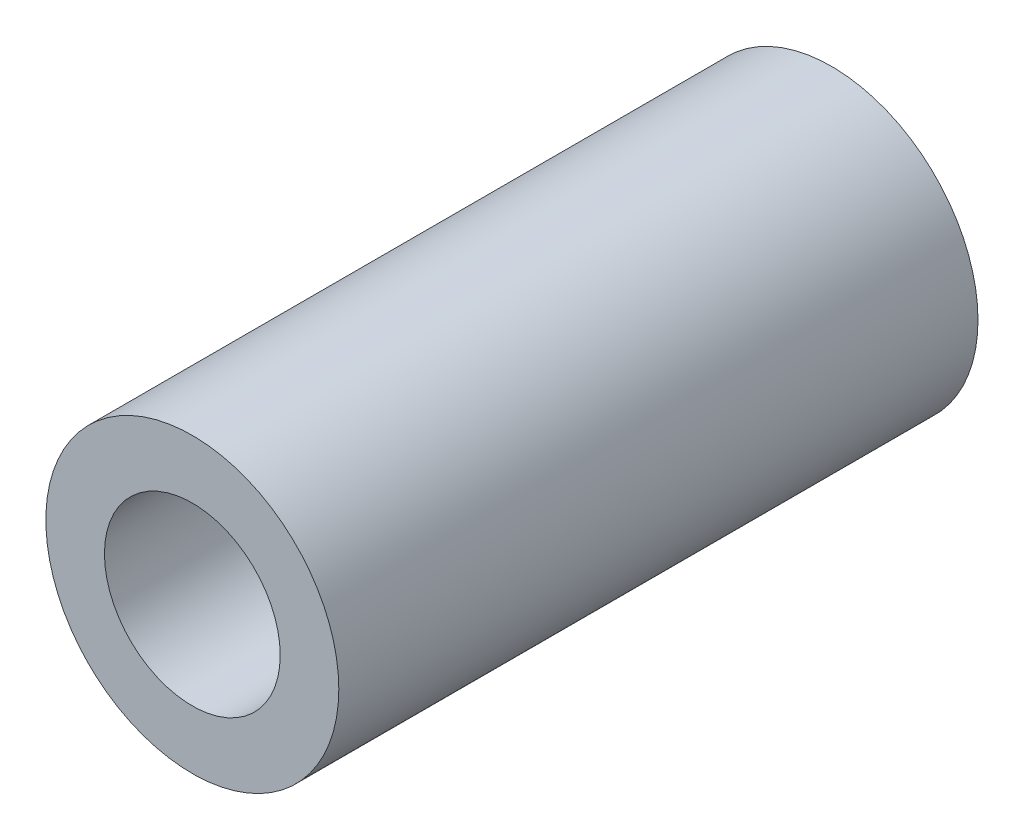
ISO-10303-21;
HEADER;
FILE_DESCRIPTION(('STEP AP214'),'2;1');
FILE_NAME('part.step','',(''),(''),'','','');
FILE_SCHEMA(('AUTOMOTIVE_DESIGN { 1 0 10303 214 1 1 1 1 }'));
ENDSEC;
DATA;
#1=APPLICATION_CONTEXT('core data for automotive mechanical design processes');
#2=APPLICATION_PROTOCOL_DEFINITION('international standard','automotive_design',2000,#1);
#3=PRODUCT_CONTEXT('',#1,'mechanical');
#4=PRODUCT('Part','Part','',(#3));
#5=PRODUCT_RELATED_PRODUCT_CATEGORY('part','',(#4));
#6=PRODUCT_DEFINITION_FORMATION('','',#4);
#7=PRODUCT_DEFINITION_CONTEXT('part definition',#1,'design');
#8=PRODUCT_DEFINITION('design','',#6,#7);
#9=PRODUCT_DEFINITION_SHAPE('','',#8);
#10=(LENGTH_UNIT() NAMED_UNIT(*) SI_UNIT(.MILLI.,.METRE.));
#11=(NAMED_UNIT(*) PLANE_ANGLE_UNIT() SI_UNIT($,.RADIAN.));
#12=(NAMED_UNIT(*) SI_UNIT($,.STERADIAN.) SOLID_ANGLE_UNIT());
#13=UNCERTAINTY_MEASURE_WITH_UNIT(LENGTH_MEASURE(1.E-05),#10,'distance_accuracy_value','');
#14=(GEOMETRIC_REPRESENTATION_CONTEXT(3) GLOBAL_UNCERTAINTY_ASSIGNED_CONTEXT((#13)) GLOBAL_UNIT_ASSIGNED_CONTEXT((#10,
#11,#12)) REPRESENTATION_CONTEXT('',''));
#15=CARTESIAN_POINT('',(0.,0.,0.));
#16=DIRECTION('',(0.,0.,1.));
#17=DIRECTION('',(1.,0.,0.));
#18=AXIS2_PLACEMENT_3D('',#15,#16,#17);
#19=CARTESIAN_POINT('',(0.,0.,12.));
#20=DIRECTION('',(0.,0.,-1.));
#21=DIRECTION('',(-1.,0.,0.));
#22=AXIS2_PLACEMENT_3D('',#19,#20,#21);
#23=CYLINDRICAL_SURFACE('',#22,2.75);
#24=CARTESIAN_POINT('',(0.,0.,12.));
#25=DIRECTION('',(0.,0.,1.));
#26=DIRECTION('',(1.,0.,0.));
#27=AXIS2_PLACEMENT_3D('',#24,#25,#26);
#28=CIRCLE('',#27,2.75);
#29=CARTESIAN_POINT('',(2.75,0.,12.));
#30=VERTEX_POINT('',#29);
#31=EDGE_CURVE('E10',#30,#30,#28,.T.);
#32=ORIENTED_EDGE('',*,*,#31,.F.);
#33=EDGE_LOOP('',(#32));
#34=FACE_BOUND('',#33,.T.);
#35=CARTESIAN_POINT('',(0.,0.,0.));
#36=DIRECTION('',(0.,0.,1.));
#37=DIRECTION('',(1.,0.,0.));
#38=AXIS2_PLACEMENT_3D('',#35,#36,#37);
#39=CIRCLE('',#38,2.75);
#40=CARTESIAN_POINT('',(2.75,0.,0.));
#41=VERTEX_POINT('',#40);
#42=EDGE_CURVE('E39',#41,#41,#39,.T.);
#43=ORIENTED_EDGE('',*,*,#42,.T.);
#44=EDGE_LOOP('',(#43));
#45=FACE_BOUND('',#44,.T.);
#46=ADVANCED_FACE('F36',(#34,#45),#23,.T.);
#47=CARTESIAN_POINT('',(0.,0.,12.));
#48=DIRECTION('',(0.,0.,1.));
#49=DIRECTION('',(1.,0.,0.));
#50=AXIS2_PLACEMENT_3D('',#47,#48,#49);
#51=PLANE('',#50);
#52=CARTESIAN_POINT('',(0.,0.,12.));
#53=DIRECTION('',(0.,0.,1.));
#54=DIRECTION('',(1.,0.,0.));
#55=AXIS2_PLACEMENT_3D('',#52,#53,#54);
#56=CIRCLE('',#55,1.65);
#57=CARTESIAN_POINT('',(1.65,0.,12.));
#58=VERTEX_POINT('',#57);
#59=EDGE_CURVE('E50',#58,#58,#56,.T.);
#60=ORIENTED_EDGE('',*,*,#59,.F.);
#61=EDGE_LOOP('',(#60));
#62=FACE_BOUND('',#61,.T.);
#63=ORIENTED_EDGE('',*,*,#31,.T.);
#64=EDGE_LOOP('',(#63));
#65=FACE_BOUND('',#64,.T.);
#66=ADVANCED_FACE('F56',(#62,#65),#51,.T.);
#67=CARTESIAN_POINT('',(0.,0.,0.));
#68=DIRECTION('',(0.,0.,1.));
#69=DIRECTION('',(1.,0.,0.));
#70=AXIS2_PLACEMENT_3D('',#67,#68,#69);
#71=PLANE('',#70);
#72=CARTESIAN_POINT('',(0.,0.,0.));
#73=DIRECTION('',(0.,0.,1.));
#74=DIRECTION('',(1.,0.,0.));
#75=AXIS2_PLACEMENT_3D('',#72,#73,#74);
#76=CIRCLE('',#75,1.64999999999999);
#77=CARTESIAN_POINT('',(1.64999999999999,0.,0.));
#78=VERTEX_POINT('',#77);
#79=EDGE_CURVE('E46',#78,#78,#76,.T.);
#80=ORIENTED_EDGE('',*,*,#79,.T.);
#81=EDGE_LOOP('',(#80));
#82=FACE_BOUND('',#81,.T.);
#83=ORIENTED_EDGE('',*,*,#42,.F.);
#84=EDGE_LOOP('',(#83));
#85=FACE_BOUND('',#84,.T.);
#86=ADVANCED_FACE('F58',(#82,#85),#71,.F.);
#87=CARTESIAN_POINT('',(0.,0.,12.));
#88=DIRECTION('',(0.,0.,1.));
#89=DIRECTION('',(1.,0.,0.));
#90=AXIS2_PLACEMENT_3D('',#87,#88,#89);
#91=CYLINDRICAL_SURFACE('',#90,1.65);
#92=ORIENTED_EDGE('',*,*,#79,.F.);
#93=EDGE_LOOP('',(#92));
#94=FACE_BOUND('',#93,.T.);
#95=ORIENTED_EDGE('',*,*,#59,.T.);
#96=EDGE_LOOP('',(#95));
#97=FACE_BOUND('',#96,.T.);
#98=ADVANCED_FACE('F54',(#94,#97),#91,.F.);
#99=CLOSED_SHELL('',(#46,#66,#86,#98));
#100=MANIFOLD_SOLID_BREP('B2',#99);
#101=ADVANCED_BREP_SHAPE_REPRESENTATION('',(#18,#100),#14);
#102=SHAPE_DEFINITION_REPRESENTATION(#9,#101);
ENDSEC;
END-ISO-10303-21;
